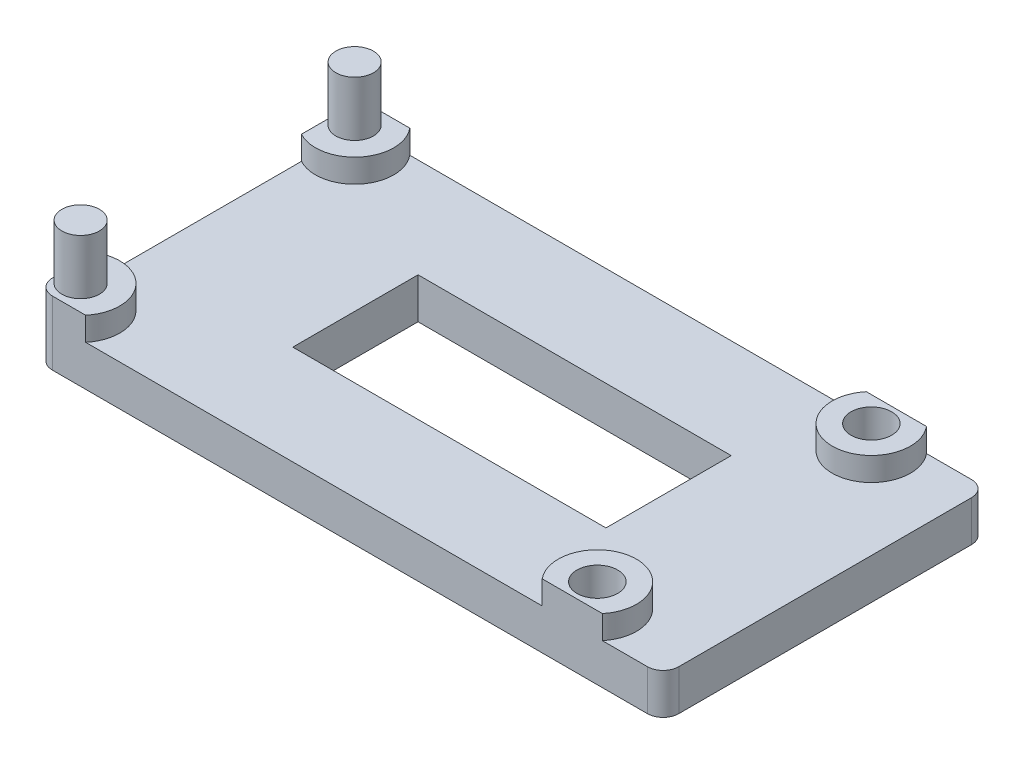
ISO-10303-21;
HEADER;
FILE_DESCRIPTION(('STEP AP214'),'2;1');
FILE_NAME('part.step','',(''),(''),'','','');
FILE_SCHEMA(('AUTOMOTIVE_DESIGN { 1 0 10303 214 1 1 1 1 }'));
ENDSEC;
DATA;
#1=APPLICATION_CONTEXT('core data for automotive mechanical design processes');
#2=APPLICATION_PROTOCOL_DEFINITION('international standard','automotive_design',2000,#1);
#3=PRODUCT_CONTEXT('',#1,'mechanical');
#4=PRODUCT('Part','Part','',(#3));
#5=PRODUCT_RELATED_PRODUCT_CATEGORY('part','',(#4));
#6=PRODUCT_DEFINITION_FORMATION('','',#4);
#7=PRODUCT_DEFINITION_CONTEXT('part definition',#1,'design');
#8=PRODUCT_DEFINITION('design','',#6,#7);
#9=PRODUCT_DEFINITION_SHAPE('','',#8);
#10=(LENGTH_UNIT() NAMED_UNIT(*) SI_UNIT(.MILLI.,.METRE.));
#11=(NAMED_UNIT(*) PLANE_ANGLE_UNIT() SI_UNIT($,.RADIAN.));
#12=(NAMED_UNIT(*) SI_UNIT($,.STERADIAN.) SOLID_ANGLE_UNIT());
#13=UNCERTAINTY_MEASURE_WITH_UNIT(LENGTH_MEASURE(1.E-05),#10,'distance_accuracy_value','');
#14=(GEOMETRIC_REPRESENTATION_CONTEXT(3) GLOBAL_UNCERTAINTY_ASSIGNED_CONTEXT((#13)) GLOBAL_UNIT_ASSIGNED_CONTEXT((#10,
#11,#12)) REPRESENTATION_CONTEXT('',''));
#15=CARTESIAN_POINT('',(0.,0.,0.));
#16=DIRECTION('',(0.,0.,1.));
#17=DIRECTION('',(1.,0.,0.));
#18=AXIS2_PLACEMENT_3D('',#15,#16,#17);
#19=CARTESIAN_POINT('',(20.,4.1,10.35));
#20=DIRECTION('',(-1.,0.,0.));
#21=DIRECTION('',(0.,0.,1.));
#22=AXIS2_PLACEMENT_3D('',#19,#20,#21);
#23=PLANE('',#22);
#24=DIRECTION('',(0.,0.,-1.));
#25=VECTOR('',#24,1.);
#26=CARTESIAN_POINT('',(20.,2.6,10.35));
#27=LINE('',#26,#25);
#28=CARTESIAN_POINT('',(20.,2.6,9.35));
#29=VERTEX_POINT('',#28);
#30=CARTESIAN_POINT('',(20.,2.6,-9.35));
#31=VERTEX_POINT('',#30);
#32=EDGE_CURVE('E238',#29,#31,#27,.T.);
#33=ORIENTED_EDGE('',*,*,#32,.F.);
#34=DIRECTION('',(0.,-1.,0.));
#35=VECTOR('',#34,1.);
#36=CARTESIAN_POINT('',(20.,4.1,9.35));
#37=LINE('',#36,#35);
#38=CARTESIAN_POINT('',(20.,0.,9.35));
#39=VERTEX_POINT('',#38);
#40=EDGE_CURVE('E334',#29,#39,#37,.T.);
#41=ORIENTED_EDGE('',*,*,#40,.T.);
#42=DIRECTION('',(0.,0.,-1.));
#43=VECTOR('',#42,1.);
#44=CARTESIAN_POINT('',(20.,0.,10.35));
#45=LINE('',#44,#43);
#46=CARTESIAN_POINT('',(20.,0.,-9.35));
#47=VERTEX_POINT('',#46);
#48=EDGE_CURVE('E287',#39,#47,#45,.T.);
#49=ORIENTED_EDGE('',*,*,#48,.T.);
#50=DIRECTION('',(0.,-1.,0.));
#51=VECTOR('',#50,1.);
#52=CARTESIAN_POINT('',(20.,4.1,-9.35));
#53=LINE('',#52,#51);
#54=EDGE_CURVE('E336',#47,#31,#53,.F.);
#55=ORIENTED_EDGE('',*,*,#54,.T.);
#56=EDGE_LOOP('',(#33,#41,#49,#55));
#57=FACE_BOUND('',#56,.T.);
#58=ADVANCED_FACE('F33',(#57),#23,.F.);
#59=CARTESIAN_POINT('',(-20.,4.1,-10.35));
#60=DIRECTION('',(0.,0.,1.));
#61=DIRECTION('',(1.,0.,0.));
#62=AXIS2_PLACEMENT_3D('',#59,#60,#61);
#63=PLANE('',#62);
#64=DIRECTION('',(-1.,0.,0.));
#65=VECTOR('',#64,1.);
#66=CARTESIAN_POINT('',(-20.,2.6,-10.35));
#67=LINE('',#66,#65);
#68=CARTESIAN_POINT('',(19.,2.6,-10.35));
#69=VERTEX_POINT('',#68);
#70=CARTESIAN_POINT('',(16.1209372712298,2.6,-10.35));
#71=VERTEX_POINT('',#70);
#72=EDGE_CURVE('E244',#69,#71,#67,.T.);
#73=ORIENTED_EDGE('',*,*,#72,.F.);
#74=DIRECTION('',(0.,-1.,0.));
#75=VECTOR('',#74,1.);
#76=CARTESIAN_POINT('',(19.,4.1,-10.35));
#77=LINE('',#76,#75);
#78=CARTESIAN_POINT('',(19.,0.,-10.35));
#79=VERTEX_POINT('',#78);
#80=EDGE_CURVE('E325',#69,#79,#77,.T.);
#81=ORIENTED_EDGE('',*,*,#80,.T.);
#82=DIRECTION('',(-1.,0.,0.));
#83=VECTOR('',#82,1.);
#84=CARTESIAN_POINT('',(-20.,0.,-10.35));
#85=LINE('',#84,#83);
#86=CARTESIAN_POINT('',(-19.,0.,-10.35));
#87=VERTEX_POINT('',#86);
#88=EDGE_CURVE('E305',#79,#87,#85,.T.);
#89=ORIENTED_EDGE('',*,*,#88,.T.);
#90=DIRECTION('',(0.,-1.,0.));
#91=VECTOR('',#90,1.);
#92=CARTESIAN_POINT('',(-19.,4.1,-10.35));
#93=LINE('',#92,#91);
#94=CARTESIAN_POINT('',(-19.,4.1,-10.35));
#95=VERTEX_POINT('',#94);
#96=EDGE_CURVE('E327',#87,#95,#93,.F.);
#97=ORIENTED_EDGE('',*,*,#96,.T.);
#98=DIRECTION('',(-1.,0.,0.));
#99=VECTOR('',#98,1.);
#100=CARTESIAN_POINT('',(-20.,4.1,-10.35));
#101=LINE('',#100,#99);
#102=CARTESIAN_POINT('',(-16.8790627287702,4.1,-10.35));
#103=VERTEX_POINT('',#102);
#104=EDGE_CURVE('E290',#103,#95,#101,.T.);
#105=ORIENTED_EDGE('',*,*,#104,.F.);
#106=DIRECTION('',(0.,1.,0.));
#107=VECTOR('',#106,1.);
#108=CARTESIAN_POINT('',(-16.8790627287702,2.6,-10.35));
#109=LINE('',#108,#107);
#110=CARTESIAN_POINT('',(-16.8790627287702,2.6,-10.35));
#111=VERTEX_POINT('',#110);
#112=EDGE_CURVE('E263',#111,#103,#109,.T.);
#113=ORIENTED_EDGE('',*,*,#112,.F.);
#114=CARTESIAN_POINT('',(12.2790627287701,2.6,-10.35));
#115=VERTEX_POINT('',#114);
#116=EDGE_CURVE('E246',#115,#111,#67,.T.);
#117=ORIENTED_EDGE('',*,*,#116,.F.);
#118=DIRECTION('',(0.,1.,0.));
#119=VECTOR('',#118,1.);
#120=CARTESIAN_POINT('',(12.2790627287701,2.6,-10.35));
#121=LINE('',#120,#119);
#122=CARTESIAN_POINT('',(12.2790627287701,4.1,-10.35));
#123=VERTEX_POINT('',#122);
#124=EDGE_CURVE('E249',#123,#115,#121,.F.);
#125=ORIENTED_EDGE('',*,*,#124,.F.);
#126=CARTESIAN_POINT('',(16.1209372712298,4.1,-10.35));
#127=VERTEX_POINT('',#126);
#128=EDGE_CURVE('E292',#127,#123,#101,.T.);
#129=ORIENTED_EDGE('',*,*,#128,.F.);
#130=DIRECTION('',(0.,1.,0.));
#131=VECTOR('',#130,1.);
#132=CARTESIAN_POINT('',(16.1209372712298,2.6,-10.35));
#133=LINE('',#132,#131);
#134=EDGE_CURVE('E251',#71,#127,#133,.T.);
#135=ORIENTED_EDGE('',*,*,#134,.F.);
#136=EDGE_LOOP('',(#73,#81,#89,#97,#105,#113,#117,#125,#129,#135));
#137=FACE_BOUND('',#136,.T.);
#138=ADVANCED_FACE('F369',(#137),#63,.F.);
#139=CARTESIAN_POINT('',(-20.,4.1,10.35));
#140=DIRECTION('',(1.,0.,0.));
#141=DIRECTION('',(0.,0.,-1.));
#142=AXIS2_PLACEMENT_3D('',#139,#140,#141);
#143=PLANE('',#142);
#144=DIRECTION('',(0.,1.,0.));
#145=VECTOR('',#144,1.);
#146=CARTESIAN_POINT('',(-20.,2.6,-6.55682878005387));
#147=LINE('',#146,#145);
#148=CARTESIAN_POINT('',(-20.,4.1,-6.55682878005387));
#149=VERTEX_POINT('',#148);
#150=CARTESIAN_POINT('',(-20.,2.6,-6.55682878005387));
#151=VERTEX_POINT('',#150);
#152=EDGE_CURVE('E261',#149,#151,#147,.F.);
#153=ORIENTED_EDGE('',*,*,#152,.F.);
#154=DIRECTION('',(0.,0.,1.));
#155=VECTOR('',#154,1.);
#156=CARTESIAN_POINT('',(-20.,4.1,10.35));
#157=LINE('',#156,#155);
#158=CARTESIAN_POINT('',(-20.,4.1,-8.75));
#159=VERTEX_POINT('',#158);
#160=EDGE_CURVE('E297',#159,#149,#157,.T.);
#161=ORIENTED_EDGE('',*,*,#160,.F.);
#162=CARTESIAN_POINT('',(-20.,4.1,-9.35));
#163=VERTEX_POINT('',#162);
#164=EDGE_CURVE('E294',#163,#159,#157,.T.);
#165=ORIENTED_EDGE('',*,*,#164,.F.);
#166=DIRECTION('',(0.,-1.,0.));
#167=VECTOR('',#166,1.);
#168=CARTESIAN_POINT('',(-20.,4.1,-9.35));
#169=LINE('',#168,#167);
#170=CARTESIAN_POINT('',(-20.,0.,-9.35));
#171=VERTEX_POINT('',#170);
#172=EDGE_CURVE('E314',#163,#171,#169,.T.);
#173=ORIENTED_EDGE('',*,*,#172,.T.);
#174=DIRECTION('',(0.,0.,1.));
#175=VECTOR('',#174,1.);
#176=CARTESIAN_POINT('',(-20.,0.,10.35));
#177=LINE('',#176,#175);
#178=CARTESIAN_POINT('',(-20.,0.,9.35));
#179=VERTEX_POINT('',#178);
#180=EDGE_CURVE('E308',#171,#179,#177,.T.);
#181=ORIENTED_EDGE('',*,*,#180,.T.);
#182=DIRECTION('',(0.,-1.,0.));
#183=VECTOR('',#182,1.);
#184=CARTESIAN_POINT('',(-20.,4.1,9.35));
#185=LINE('',#184,#183);
#186=CARTESIAN_POINT('',(-20.,4.1,9.35));
#187=VERTEX_POINT('',#186);
#188=EDGE_CURVE('E302',#179,#187,#185,.F.);
#189=ORIENTED_EDGE('',*,*,#188,.T.);
#190=CARTESIAN_POINT('',(-20.,4.1,8.75));
#191=VERTEX_POINT('',#190);
#192=EDGE_CURVE('E377',#191,#187,#157,.T.);
#193=ORIENTED_EDGE('',*,*,#192,.F.);
#194=CARTESIAN_POINT('',(-20.,4.1,6.55682878005387));
#195=VERTEX_POINT('',#194);
#196=EDGE_CURVE('E298',#195,#191,#157,.T.);
#197=ORIENTED_EDGE('',*,*,#196,.F.);
#198=DIRECTION('',(0.,1.,0.));
#199=VECTOR('',#198,1.);
#200=CARTESIAN_POINT('',(-20.,2.6,6.55682878005387));
#201=LINE('',#200,#199);
#202=CARTESIAN_POINT('',(-20.,2.6,6.55682878005387));
#203=VERTEX_POINT('',#202);
#204=EDGE_CURVE('E259',#203,#195,#201,.T.);
#205=ORIENTED_EDGE('',*,*,#204,.F.);
#206=DIRECTION('',(0.,0.,1.));
#207=VECTOR('',#206,1.);
#208=CARTESIAN_POINT('',(-20.,2.6,10.35));
#209=LINE('',#208,#207);
#210=EDGE_CURVE('E247',#151,#203,#209,.T.);
#211=ORIENTED_EDGE('',*,*,#210,.F.);
#212=EDGE_LOOP('',(#153,#161,#165,#173,#181,#189,#193,#197,#205,#211));
#213=FACE_BOUND('',#212,.T.);
#214=ADVANCED_FACE('F392',(#213),#143,.F.);
#215=CARTESIAN_POINT('',(-20.,4.1,10.35));
#216=DIRECTION('',(0.,0.,-1.));
#217=DIRECTION('',(-1.,0.,0.));
#218=AXIS2_PLACEMENT_3D('',#215,#216,#217);
#219=PLANE('',#218);
#220=DIRECTION('',(0.,1.,0.));
#221=VECTOR('',#220,1.);
#222=CARTESIAN_POINT('',(-16.8790627287701,2.6,10.35));
#223=LINE('',#222,#221);
#224=CARTESIAN_POINT('',(-16.8790627287701,4.1,10.35));
#225=VERTEX_POINT('',#224);
#226=CARTESIAN_POINT('',(-16.8790627287701,2.6,10.35));
#227=VERTEX_POINT('',#226);
#228=EDGE_CURVE('E257',#225,#227,#223,.F.);
#229=ORIENTED_EDGE('',*,*,#228,.F.);
#230=DIRECTION('',(1.,0.,0.));
#231=VECTOR('',#230,1.);
#232=CARTESIAN_POINT('',(-20.,4.1,10.35));
#233=LINE('',#232,#231);
#234=CARTESIAN_POINT('',(-19.,4.1,10.35));
#235=VERTEX_POINT('',#234);
#236=EDGE_CURVE('E299',#235,#225,#233,.T.);
#237=ORIENTED_EDGE('',*,*,#236,.F.);
#238=DIRECTION('',(0.,-1.,0.));
#239=VECTOR('',#238,1.);
#240=CARTESIAN_POINT('',(-19.,4.1,10.35));
#241=LINE('',#240,#239);
#242=CARTESIAN_POINT('',(-19.,0.,10.35));
#243=VERTEX_POINT('',#242);
#244=EDGE_CURVE('E339',#235,#243,#241,.T.);
#245=ORIENTED_EDGE('',*,*,#244,.T.);
#246=DIRECTION('',(1.,0.,0.));
#247=VECTOR('',#246,1.);
#248=CARTESIAN_POINT('',(-20.,0.,10.35));
#249=LINE('',#248,#247);
#250=CARTESIAN_POINT('',(19.,0.,10.35));
#251=VERTEX_POINT('',#250);
#252=EDGE_CURVE('E293',#243,#251,#249,.T.);
#253=ORIENTED_EDGE('',*,*,#252,.T.);
#254=DIRECTION('',(0.,-1.,0.));
#255=VECTOR('',#254,1.);
#256=CARTESIAN_POINT('',(19.,4.1,10.35));
#257=LINE('',#256,#255);
#258=CARTESIAN_POINT('',(19.,2.6,10.35));
#259=VERTEX_POINT('',#258);
#260=EDGE_CURVE('E41',#251,#259,#257,.F.);
#261=ORIENTED_EDGE('',*,*,#260,.T.);
#262=DIRECTION('',(1.,0.,0.));
#263=VECTOR('',#262,1.);
#264=CARTESIAN_POINT('',(-20.,2.6,10.35));
#265=LINE('',#264,#263);
#266=CARTESIAN_POINT('',(16.1209372712299,2.6,10.35));
#267=VERTEX_POINT('',#266);
#268=EDGE_CURVE('E234',#267,#259,#265,.T.);
#269=ORIENTED_EDGE('',*,*,#268,.F.);
#270=DIRECTION('',(0.,1.,0.));
#271=VECTOR('',#270,1.);
#272=CARTESIAN_POINT('',(16.1209372712299,2.6,10.35));
#273=LINE('',#272,#271);
#274=CARTESIAN_POINT('',(16.1209372712299,4.1,10.35));
#275=VERTEX_POINT('',#274);
#276=EDGE_CURVE('E253',#275,#267,#273,.F.);
#277=ORIENTED_EDGE('',*,*,#276,.F.);
#278=CARTESIAN_POINT('',(12.2790627287701,4.1,10.35));
#279=VERTEX_POINT('',#278);
#280=EDGE_CURVE('E296',#279,#275,#233,.T.);
#281=ORIENTED_EDGE('',*,*,#280,.F.);
#282=DIRECTION('',(0.,1.,0.));
#283=VECTOR('',#282,1.);
#284=CARTESIAN_POINT('',(12.2790627287701,2.6,10.35));
#285=LINE('',#284,#283);
#286=CARTESIAN_POINT('',(12.2790627287701,2.6,10.35));
#287=VERTEX_POINT('',#286);
#288=EDGE_CURVE('E255',#287,#279,#285,.T.);
#289=ORIENTED_EDGE('',*,*,#288,.F.);
#290=EDGE_CURVE('E239',#227,#287,#265,.T.);
#291=ORIENTED_EDGE('',*,*,#290,.F.);
#292=EDGE_LOOP('',(#229,#237,#245,#253,#261,#269,#277,#281,#289,#291));
#293=FACE_BOUND('',#292,.T.);
#294=ADVANCED_FACE('F346',(#293),#219,.F.);
#295=CARTESIAN_POINT('',(0.,4.1,0.));
#296=DIRECTION('',(0.,-1.,0.));
#297=DIRECTION('',(0.,0.,-1.));
#298=AXIS2_PLACEMENT_3D('',#295,#296,#297);
#299=PLANE('',#298);
#300=CARTESIAN_POINT('',(-18.8,4.1,-8.75));
#301=DIRECTION('',(0.,1.,0.));
#302=DIRECTION('',(0.,0.,1.));
#303=AXIS2_PLACEMENT_3D('',#300,#301,#302);
#304=CIRCLE('',#303,2.5);
#305=EDGE_CURVE('E228',#149,#103,#304,.T.);
#306=ORIENTED_EDGE('',*,*,#305,.T.);
#307=ORIENTED_EDGE('',*,*,#104,.T.);
#308=CARTESIAN_POINT('',(-19.,4.1,-9.35));
#309=DIRECTION('',(0.,-1.,0.));
#310=DIRECTION('',(0.,0.,-1.));
#311=AXIS2_PLACEMENT_3D('',#308,#309,#310);
#312=CIRCLE('',#311,1.);
#313=EDGE_CURVE('E332',#95,#163,#312,.F.);
#314=ORIENTED_EDGE('',*,*,#313,.T.);
#315=ORIENTED_EDGE('',*,*,#164,.T.);
#316=CARTESIAN_POINT('',(-18.8,4.1,-8.75));
#317=DIRECTION('',(0.,1.,0.));
#318=DIRECTION('',(0.,0.,1.));
#319=AXIS2_PLACEMENT_3D('',#316,#317,#318);
#320=CIRCLE('',#319,1.2);
#321=EDGE_CURVE('E281',#159,#159,#320,.T.);
#322=ORIENTED_EDGE('',*,*,#321,.F.);
#323=ORIENTED_EDGE('',*,*,#160,.T.);
#324=EDGE_LOOP('',(#306,#307,#314,#315,#322,#323));
#325=FACE_BOUND('',#324,.T.);
#326=ADVANCED_FACE('F387',(#325),#299,.F.);
#327=CARTESIAN_POINT('',(-18.8,4.1,8.75));
#328=DIRECTION('',(0.,1.,0.));
#329=DIRECTION('',(0.,0.,1.));
#330=AXIS2_PLACEMENT_3D('',#327,#328,#329);
#331=CIRCLE('',#330,2.5);
#332=EDGE_CURVE('E222',#225,#195,#331,.T.);
#333=ORIENTED_EDGE('',*,*,#332,.T.);
#334=ORIENTED_EDGE('',*,*,#196,.T.);
#335=CARTESIAN_POINT('',(-18.8,4.1,8.75));
#336=DIRECTION('',(0.,1.,0.));
#337=DIRECTION('',(0.,0.,1.));
#338=AXIS2_PLACEMENT_3D('',#335,#336,#337);
#339=CIRCLE('',#338,1.2);
#340=EDGE_CURVE('E269',#191,#191,#339,.T.);
#341=ORIENTED_EDGE('',*,*,#340,.F.);
#342=ORIENTED_EDGE('',*,*,#192,.T.);
#343=CARTESIAN_POINT('',(-19.,4.1,9.35));
#344=DIRECTION('',(0.,-1.,0.));
#345=DIRECTION('',(0.,0.,-1.));
#346=AXIS2_PLACEMENT_3D('',#343,#344,#345);
#347=CIRCLE('',#346,1.);
#348=EDGE_CURVE('E330',#187,#235,#347,.F.);
#349=ORIENTED_EDGE('',*,*,#348,.T.);
#350=ORIENTED_EDGE('',*,*,#236,.T.);
#351=EDGE_LOOP('',(#333,#334,#341,#342,#349,#350));
#352=FACE_BOUND('',#351,.T.);
#353=ADVANCED_FACE('F413',(#352),#299,.F.);
#354=CARTESIAN_POINT('',(14.2,4.1,8.75));
#355=DIRECTION('',(0.,1.,0.));
#356=DIRECTION('',(0.,0.,1.));
#357=AXIS2_PLACEMENT_3D('',#354,#355,#356);
#358=CIRCLE('',#357,1.3);
#359=CARTESIAN_POINT('',(14.2,4.1,10.05));
#360=VERTEX_POINT('',#359);
#361=EDGE_CURVE('E265',#360,#360,#358,.T.);
#362=ORIENTED_EDGE('',*,*,#361,.F.);
#363=EDGE_LOOP('',(#362));
#364=FACE_BOUND('',#363,.T.);
#365=CARTESIAN_POINT('',(14.2,4.1,8.75));
#366=DIRECTION('',(0.,1.,0.));
#367=DIRECTION('',(0.,0.,1.));
#368=AXIS2_PLACEMENT_3D('',#365,#366,#367);
#369=CIRCLE('',#368,2.5);
#370=EDGE_CURVE('E216',#275,#279,#369,.T.);
#371=ORIENTED_EDGE('',*,*,#370,.T.);
#372=ORIENTED_EDGE('',*,*,#280,.T.);
#373=EDGE_LOOP('',(#371,#372));
#374=FACE_BOUND('',#373,.T.);
#375=ADVANCED_FACE('F479',(#364,#374),#299,.F.);
#376=CARTESIAN_POINT('',(14.2,4.1,-8.75));
#377=DIRECTION('',(0.,1.,0.));
#378=DIRECTION('',(0.,0.,1.));
#379=AXIS2_PLACEMENT_3D('',#376,#377,#378);
#380=CIRCLE('',#379,1.3);
#381=CARTESIAN_POINT('',(14.2,4.1,-7.45));
#382=VERTEX_POINT('',#381);
#383=EDGE_CURVE('E270',#382,#382,#380,.T.);
#384=ORIENTED_EDGE('',*,*,#383,.F.);
#385=EDGE_LOOP('',(#384));
#386=FACE_BOUND('',#385,.T.);
#387=CARTESIAN_POINT('',(14.2,4.1,-8.75));
#388=DIRECTION('',(0.,1.,0.));
#389=DIRECTION('',(0.,0.,1.));
#390=AXIS2_PLACEMENT_3D('',#387,#388,#389);
#391=CIRCLE('',#390,2.5);
#392=EDGE_CURVE('E209',#123,#127,#391,.T.);
#393=ORIENTED_EDGE('',*,*,#392,.T.);
#394=ORIENTED_EDGE('',*,*,#128,.T.);
#395=EDGE_LOOP('',(#393,#394));
#396=FACE_BOUND('',#395,.T.);
#397=ADVANCED_FACE('F376',(#386,#396),#299,.F.);
#398=CARTESIAN_POINT('',(19.,4.1,-9.35));
#399=DIRECTION('',(0.,-1.,0.));
#400=DIRECTION('',(0.,0.,-1.));
#401=AXIS2_PLACEMENT_3D('',#398,#399,#400);
#402=CYLINDRICAL_SURFACE('',#401,1.);
#403=ORIENTED_EDGE('',*,*,#80,.F.);
#404=CARTESIAN_POINT('',(19.,2.6,-9.35));
#405=DIRECTION('',(0.,1.,0.));
#406=DIRECTION('',(0.,0.,1.));
#407=AXIS2_PLACEMENT_3D('',#404,#405,#406);
#408=CIRCLE('',#407,1.);
#409=EDGE_CURVE('E241',#69,#31,#408,.F.);
#410=ORIENTED_EDGE('',*,*,#409,.T.);
#411=ORIENTED_EDGE('',*,*,#54,.F.);
#412=CARTESIAN_POINT('',(19.,0.,-9.35));
#413=DIRECTION('',(0.,-1.,0.));
#414=DIRECTION('',(0.,0.,-1.));
#415=AXIS2_PLACEMENT_3D('',#412,#413,#414);
#416=CIRCLE('',#415,1.);
#417=EDGE_CURVE('E321',#79,#47,#416,.T.);
#418=ORIENTED_EDGE('',*,*,#417,.F.);
#419=EDGE_LOOP('',(#403,#410,#411,#418));
#420=FACE_BOUND('',#419,.T.);
#421=ADVANCED_FACE('F363',(#420),#402,.T.);
#422=CARTESIAN_POINT('',(19.,4.1,9.35));
#423=DIRECTION('',(0.,-1.,0.));
#424=DIRECTION('',(0.,0.,-1.));
#425=AXIS2_PLACEMENT_3D('',#422,#423,#424);
#426=CYLINDRICAL_SURFACE('',#425,1.);
#427=ORIENTED_EDGE('',*,*,#40,.F.);
#428=CARTESIAN_POINT('',(19.,2.6,9.35));
#429=DIRECTION('',(0.,1.,0.));
#430=DIRECTION('',(0.,0.,1.));
#431=AXIS2_PLACEMENT_3D('',#428,#429,#430);
#432=CIRCLE('',#431,1.);
#433=EDGE_CURVE('E11',#29,#259,#432,.F.);
#434=ORIENTED_EDGE('',*,*,#433,.T.);
#435=ORIENTED_EDGE('',*,*,#260,.F.);
#436=CARTESIAN_POINT('',(19.,0.,9.35));
#437=DIRECTION('',(0.,-1.,0.));
#438=DIRECTION('',(0.,0.,-1.));
#439=AXIS2_PLACEMENT_3D('',#436,#437,#438);
#440=CIRCLE('',#439,1.);
#441=EDGE_CURVE('E319',#39,#251,#440,.T.);
#442=ORIENTED_EDGE('',*,*,#441,.F.);
#443=EDGE_LOOP('',(#427,#434,#435,#442));
#444=FACE_BOUND('',#443,.T.);
#445=ADVANCED_FACE('F352',(#444),#426,.T.);
#446=CARTESIAN_POINT('',(0.,0.,0.));
#447=DIRECTION('',(0.,-1.,0.));
#448=DIRECTION('',(0.,0.,-1.));
#449=AXIS2_PLACEMENT_3D('',#446,#447,#448);
#450=PLANE('',#449);
#451=DIRECTION('',(0.,0.,-1.));
#452=VECTOR('',#451,1.);
#453=CARTESIAN_POINT('',(10.,0.,4.));
#454=LINE('',#453,#452);
#455=CARTESIAN_POINT('',(10.,0.,4.));
#456=VERTEX_POINT('',#455);
#457=CARTESIAN_POINT('',(10.,0.,-4.));
#458=VERTEX_POINT('',#457);
#459=EDGE_CURVE('E178',#456,#458,#454,.T.);
#460=ORIENTED_EDGE('',*,*,#459,.T.);
#461=DIRECTION('',(-1.,0.,0.));
#462=VECTOR('',#461,1.);
#463=CARTESIAN_POINT('',(-10.,0.,-4.));
#464=LINE('',#463,#462);
#465=CARTESIAN_POINT('',(-10.,0.,-4.));
#466=VERTEX_POINT('',#465);
#467=EDGE_CURVE('E187',#458,#466,#464,.T.);
#468=ORIENTED_EDGE('',*,*,#467,.T.);
#469=DIRECTION('',(0.,0.,1.));
#470=VECTOR('',#469,1.);
#471=CARTESIAN_POINT('',(-10.,0.,4.));
#472=LINE('',#471,#470);
#473=CARTESIAN_POINT('',(-10.,0.,4.));
#474=VERTEX_POINT('',#473);
#475=EDGE_CURVE('E48',#466,#474,#472,.T.);
#476=ORIENTED_EDGE('',*,*,#475,.T.);
#477=DIRECTION('',(1.,0.,0.));
#478=VECTOR('',#477,1.);
#479=CARTESIAN_POINT('',(-10.,0.,4.));
#480=LINE('',#479,#478);
#481=EDGE_CURVE('E184',#474,#456,#480,.T.);
#482=ORIENTED_EDGE('',*,*,#481,.T.);
#483=EDGE_LOOP('',(#460,#468,#476,#482));
#484=FACE_BOUND('',#483,.T.);
#485=CARTESIAN_POINT('',(14.2,0.,-8.75));
#486=DIRECTION('',(0.,1.,0.));
#487=DIRECTION('',(0.,0.,1.));
#488=AXIS2_PLACEMENT_3D('',#485,#486,#487);
#489=CIRCLE('',#488,1.3);
#490=CARTESIAN_POINT('',(14.2,0.,-7.45));
#491=VERTEX_POINT('',#490);
#492=EDGE_CURVE('E266',#491,#491,#489,.T.);
#493=ORIENTED_EDGE('',*,*,#492,.T.);
#494=EDGE_LOOP('',(#493));
#495=FACE_BOUND('',#494,.T.);
#496=CARTESIAN_POINT('',(14.2,0.,8.75));
#497=DIRECTION('',(0.,1.,0.));
#498=DIRECTION('',(0.,0.,1.));
#499=AXIS2_PLACEMENT_3D('',#496,#497,#498);
#500=CIRCLE('',#499,1.3);
#501=CARTESIAN_POINT('',(14.2,0.,10.05));
#502=VERTEX_POINT('',#501);
#503=EDGE_CURVE('E273',#502,#502,#500,.T.);
#504=ORIENTED_EDGE('',*,*,#503,.T.);
#505=EDGE_LOOP('',(#504));
#506=FACE_BOUND('',#505,.T.);
#507=ORIENTED_EDGE('',*,*,#180,.F.);
#508=CARTESIAN_POINT('',(-19.,0.,-9.35));
#509=DIRECTION('',(0.,-1.,0.));
#510=DIRECTION('',(0.,0.,-1.));
#511=AXIS2_PLACEMENT_3D('',#508,#509,#510);
#512=CIRCLE('',#511,1.);
#513=EDGE_CURVE('E323',#171,#87,#512,.T.);
#514=ORIENTED_EDGE('',*,*,#513,.T.);
#515=ORIENTED_EDGE('',*,*,#88,.F.);
#516=ORIENTED_EDGE('',*,*,#417,.T.);
#517=ORIENTED_EDGE('',*,*,#48,.F.);
#518=ORIENTED_EDGE('',*,*,#441,.T.);
#519=ORIENTED_EDGE('',*,*,#252,.F.);
#520=CARTESIAN_POINT('',(-19.,0.,9.35));
#521=DIRECTION('',(0.,-1.,0.));
#522=DIRECTION('',(0.,0.,-1.));
#523=AXIS2_PLACEMENT_3D('',#520,#521,#522);
#524=CIRCLE('',#523,1.);
#525=EDGE_CURVE('E317',#243,#179,#524,.T.);
#526=ORIENTED_EDGE('',*,*,#525,.T.);
#527=EDGE_LOOP('',(#507,#514,#515,#516,#517,#518,#519,#526));
#528=FACE_BOUND('',#527,.T.);
#529=ADVANCED_FACE('F191',(#484,#495,#506,#528),#450,.T.);
#530=CARTESIAN_POINT('',(-18.8,7.6,-8.75));
#531=DIRECTION('',(0.,-1.,0.));
#532=DIRECTION('',(0.,0.,-1.));
#533=AXIS2_PLACEMENT_3D('',#530,#531,#532);
#534=CYLINDRICAL_SURFACE('',#533,1.2);
#535=CARTESIAN_POINT('',(-18.8,7.6,-8.75));
#536=DIRECTION('',(0.,1.,0.));
#537=DIRECTION('',(0.,0.,1.));
#538=AXIS2_PLACEMENT_3D('',#535,#536,#537);
#539=CIRCLE('',#538,1.2);
#540=CARTESIAN_POINT('',(-18.8,7.6,-7.55));
#541=VERTEX_POINT('',#540);
#542=EDGE_CURVE('E284',#541,#541,#539,.T.);
#543=ORIENTED_EDGE('',*,*,#542,.F.);
#544=EDGE_LOOP('',(#543));
#545=FACE_BOUND('',#544,.T.);
#546=ORIENTED_EDGE('',*,*,#321,.T.);
#547=EDGE_LOOP('',(#546));
#548=FACE_BOUND('',#547,.T.);
#549=ADVANCED_FACE('F430',(#545,#548),#534,.T.);
#550=CARTESIAN_POINT('',(-18.8,7.6,-8.75));
#551=DIRECTION('',(0.,1.,0.));
#552=DIRECTION('',(0.,0.,1.));
#553=AXIS2_PLACEMENT_3D('',#550,#551,#552);
#554=PLANE('',#553);
#555=ORIENTED_EDGE('',*,*,#542,.T.);
#556=EDGE_LOOP('',(#555));
#557=FACE_BOUND('',#556,.T.);
#558=ADVANCED_FACE('F420',(#557),#554,.T.);
#559=CARTESIAN_POINT('',(-18.8,7.6,8.75));
#560=DIRECTION('',(0.,-1.,0.));
#561=DIRECTION('',(0.,0.,-1.));
#562=AXIS2_PLACEMENT_3D('',#559,#560,#561);
#563=CYLINDRICAL_SURFACE('',#562,1.2);
#564=CARTESIAN_POINT('',(-18.8,7.6,8.75));
#565=DIRECTION('',(0.,1.,0.));
#566=DIRECTION('',(0.,0.,1.));
#567=AXIS2_PLACEMENT_3D('',#564,#565,#566);
#568=CIRCLE('',#567,1.2);
#569=CARTESIAN_POINT('',(-18.8,7.6,9.95));
#570=VERTEX_POINT('',#569);
#571=EDGE_CURVE('E278',#570,#570,#568,.T.);
#572=ORIENTED_EDGE('',*,*,#571,.F.);
#573=EDGE_LOOP('',(#572));
#574=FACE_BOUND('',#573,.T.);
#575=ORIENTED_EDGE('',*,*,#340,.T.);
#576=EDGE_LOOP('',(#575));
#577=FACE_BOUND('',#576,.T.);
#578=ADVANCED_FACE('F417',(#574,#577),#563,.T.);
#579=CARTESIAN_POINT('',(-18.8,7.6,8.75));
#580=DIRECTION('',(0.,1.,0.));
#581=DIRECTION('',(0.,0.,1.));
#582=AXIS2_PLACEMENT_3D('',#579,#580,#581);
#583=PLANE('',#582);
#584=ORIENTED_EDGE('',*,*,#571,.T.);
#585=EDGE_LOOP('',(#584));
#586=FACE_BOUND('',#585,.T.);
#587=ADVANCED_FACE('F419',(#586),#583,.T.);
#588=CARTESIAN_POINT('',(14.2,0.,8.75));
#589=DIRECTION('',(0.,1.,0.));
#590=DIRECTION('',(0.,0.,1.));
#591=AXIS2_PLACEMENT_3D('',#588,#589,#590);
#592=CYLINDRICAL_SURFACE('',#591,1.3);
#593=ORIENTED_EDGE('',*,*,#503,.F.);
#594=EDGE_LOOP('',(#593));
#595=FACE_BOUND('',#594,.T.);
#596=ORIENTED_EDGE('',*,*,#361,.T.);
#597=EDGE_LOOP('',(#596));
#598=FACE_BOUND('',#597,.T.);
#599=ADVANCED_FACE('F427',(#595,#598),#592,.F.);
#600=CARTESIAN_POINT('',(14.2,0.,-8.75));
#601=DIRECTION('',(0.,1.,0.));
#602=DIRECTION('',(0.,0.,1.));
#603=AXIS2_PLACEMENT_3D('',#600,#601,#602);
#604=CYLINDRICAL_SURFACE('',#603,1.3);
#605=ORIENTED_EDGE('',*,*,#492,.F.);
#606=EDGE_LOOP('',(#605));
#607=FACE_BOUND('',#606,.T.);
#608=ORIENTED_EDGE('',*,*,#383,.T.);
#609=EDGE_LOOP('',(#608));
#610=FACE_BOUND('',#609,.T.);
#611=ADVANCED_FACE('F444',(#607,#610),#604,.F.);
#612=CARTESIAN_POINT('',(-19.,4.1,-9.35));
#613=DIRECTION('',(0.,-1.,0.));
#614=DIRECTION('',(0.,0.,-1.));
#615=AXIS2_PLACEMENT_3D('',#612,#613,#614);
#616=CYLINDRICAL_SURFACE('',#615,1.);
#617=ORIENTED_EDGE('',*,*,#313,.F.);
#618=ORIENTED_EDGE('',*,*,#96,.F.);
#619=ORIENTED_EDGE('',*,*,#513,.F.);
#620=ORIENTED_EDGE('',*,*,#172,.F.);
#621=EDGE_LOOP('',(#617,#618,#619,#620));
#622=FACE_BOUND('',#621,.T.);
#623=ADVANCED_FACE('F405',(#622),#616,.T.);
#624=CARTESIAN_POINT('',(-19.,4.1,9.35));
#625=DIRECTION('',(0.,-1.,0.));
#626=DIRECTION('',(0.,0.,-1.));
#627=AXIS2_PLACEMENT_3D('',#624,#625,#626);
#628=CYLINDRICAL_SURFACE('',#627,1.);
#629=ORIENTED_EDGE('',*,*,#348,.F.);
#630=ORIENTED_EDGE('',*,*,#188,.F.);
#631=ORIENTED_EDGE('',*,*,#525,.F.);
#632=ORIENTED_EDGE('',*,*,#244,.F.);
#633=EDGE_LOOP('',(#629,#630,#631,#632));
#634=FACE_BOUND('',#633,.T.);
#635=ADVANCED_FACE('F35',(#634),#628,.T.);
#636=CARTESIAN_POINT('',(-18.8,2.6,-8.75));
#637=DIRECTION('',(0.,1.,0.));
#638=DIRECTION('',(0.,0.,1.));
#639=AXIS2_PLACEMENT_3D('',#636,#637,#638);
#640=CYLINDRICAL_SURFACE('',#639,2.5);
#641=ORIENTED_EDGE('',*,*,#112,.T.);
#642=ORIENTED_EDGE('',*,*,#305,.F.);
#643=ORIENTED_EDGE('',*,*,#152,.T.);
#644=CARTESIAN_POINT('',(-18.8,2.6,-8.75));
#645=DIRECTION('',(0.,1.,0.));
#646=DIRECTION('',(0.,0.,1.));
#647=AXIS2_PLACEMENT_3D('',#644,#645,#646);
#648=CIRCLE('',#647,2.5);
#649=EDGE_CURVE('E231',#151,#111,#648,.T.);
#650=ORIENTED_EDGE('',*,*,#649,.T.);
#651=EDGE_LOOP('',(#641,#642,#643,#650));
#652=FACE_BOUND('',#651,.T.);
#653=ADVANCED_FACE('F398',(#652),#640,.T.);
#654=CARTESIAN_POINT('',(-18.8,2.6,8.75));
#655=DIRECTION('',(0.,1.,0.));
#656=DIRECTION('',(0.,0.,1.));
#657=AXIS2_PLACEMENT_3D('',#654,#655,#656);
#658=CYLINDRICAL_SURFACE('',#657,2.5);
#659=ORIENTED_EDGE('',*,*,#204,.T.);
#660=ORIENTED_EDGE('',*,*,#332,.F.);
#661=ORIENTED_EDGE('',*,*,#228,.T.);
#662=CARTESIAN_POINT('',(-18.8,2.6,8.75));
#663=DIRECTION('',(0.,1.,0.));
#664=DIRECTION('',(0.,0.,1.));
#665=AXIS2_PLACEMENT_3D('',#662,#663,#664);
#666=CIRCLE('',#665,2.5);
#667=EDGE_CURVE('E225',#227,#203,#666,.T.);
#668=ORIENTED_EDGE('',*,*,#667,.T.);
#669=EDGE_LOOP('',(#659,#660,#661,#668));
#670=FACE_BOUND('',#669,.T.);
#671=ADVANCED_FACE('F509',(#670),#658,.T.);
#672=CARTESIAN_POINT('',(14.2,2.6,8.75));
#673=DIRECTION('',(0.,1.,0.));
#674=DIRECTION('',(0.,0.,1.));
#675=AXIS2_PLACEMENT_3D('',#672,#673,#674);
#676=CYLINDRICAL_SURFACE('',#675,2.5);
#677=ORIENTED_EDGE('',*,*,#288,.T.);
#678=ORIENTED_EDGE('',*,*,#370,.F.);
#679=ORIENTED_EDGE('',*,*,#276,.T.);
#680=CARTESIAN_POINT('',(14.2,2.6,8.75));
#681=DIRECTION('',(0.,1.,0.));
#682=DIRECTION('',(0.,0.,1.));
#683=AXIS2_PLACEMENT_3D('',#680,#681,#682);
#684=CIRCLE('',#683,2.5);
#685=EDGE_CURVE('E219',#267,#287,#684,.T.);
#686=ORIENTED_EDGE('',*,*,#685,.T.);
#687=EDGE_LOOP('',(#677,#678,#679,#686));
#688=FACE_BOUND('',#687,.T.);
#689=ADVANCED_FACE('F520',(#688),#676,.T.);
#690=CARTESIAN_POINT('',(14.2,2.6,-8.75));
#691=DIRECTION('',(0.,1.,0.));
#692=DIRECTION('',(0.,0.,1.));
#693=AXIS2_PLACEMENT_3D('',#690,#691,#692);
#694=CYLINDRICAL_SURFACE('',#693,2.5);
#695=ORIENTED_EDGE('',*,*,#134,.T.);
#696=ORIENTED_EDGE('',*,*,#392,.F.);
#697=ORIENTED_EDGE('',*,*,#124,.T.);
#698=CARTESIAN_POINT('',(14.2,2.6,-8.75));
#699=DIRECTION('',(0.,1.,0.));
#700=DIRECTION('',(0.,0.,1.));
#701=AXIS2_PLACEMENT_3D('',#698,#699,#700);
#702=CIRCLE('',#701,2.5);
#703=EDGE_CURVE('E213',#115,#71,#702,.T.);
#704=ORIENTED_EDGE('',*,*,#703,.T.);
#705=EDGE_LOOP('',(#695,#696,#697,#704));
#706=FACE_BOUND('',#705,.T.);
#707=ADVANCED_FACE('F374',(#706),#694,.T.);
#708=CARTESIAN_POINT('',(0.,2.6,0.));
#709=DIRECTION('',(0.,1.,0.));
#710=DIRECTION('',(0.,0.,1.));
#711=AXIS2_PLACEMENT_3D('',#708,#709,#710);
#712=PLANE('',#711);
#713=DIRECTION('',(0.,0.,-1.));
#714=VECTOR('',#713,1.);
#715=CARTESIAN_POINT('',(10.,2.6,4.));
#716=LINE('',#715,#714);
#717=CARTESIAN_POINT('',(10.,2.6,4.));
#718=VERTEX_POINT('',#717);
#719=CARTESIAN_POINT('',(10.,2.6,-4.));
#720=VERTEX_POINT('',#719);
#721=EDGE_CURVE('E56',#718,#720,#716,.T.);
#722=ORIENTED_EDGE('',*,*,#721,.F.);
#723=DIRECTION('',(1.,0.,0.));
#724=VECTOR('',#723,1.);
#725=CARTESIAN_POINT('',(-10.,2.6,4.));
#726=LINE('',#725,#724);
#727=CARTESIAN_POINT('',(-10.,2.6,4.));
#728=VERTEX_POINT('',#727);
#729=EDGE_CURVE('E194',#728,#718,#726,.T.);
#730=ORIENTED_EDGE('',*,*,#729,.F.);
#731=DIRECTION('',(0.,0.,1.));
#732=VECTOR('',#731,1.);
#733=CARTESIAN_POINT('',(-10.,2.6,4.));
#734=LINE('',#733,#732);
#735=CARTESIAN_POINT('',(-10.,2.6,-4.));
#736=VERTEX_POINT('',#735);
#737=EDGE_CURVE('E197',#736,#728,#734,.T.);
#738=ORIENTED_EDGE('',*,*,#737,.F.);
#739=DIRECTION('',(-1.,0.,0.));
#740=VECTOR('',#739,1.);
#741=CARTESIAN_POINT('',(-10.,2.6,-4.));
#742=LINE('',#741,#740);
#743=EDGE_CURVE('E203',#720,#736,#742,.T.);
#744=ORIENTED_EDGE('',*,*,#743,.F.);
#745=EDGE_LOOP('',(#722,#730,#738,#744));
#746=FACE_BOUND('',#745,.T.);
#747=ORIENTED_EDGE('',*,*,#116,.T.);
#748=ORIENTED_EDGE('',*,*,#649,.F.);
#749=ORIENTED_EDGE('',*,*,#210,.T.);
#750=ORIENTED_EDGE('',*,*,#667,.F.);
#751=ORIENTED_EDGE('',*,*,#290,.T.);
#752=ORIENTED_EDGE('',*,*,#685,.F.);
#753=ORIENTED_EDGE('',*,*,#268,.T.);
#754=ORIENTED_EDGE('',*,*,#433,.F.);
#755=ORIENTED_EDGE('',*,*,#32,.T.);
#756=ORIENTED_EDGE('',*,*,#409,.F.);
#757=ORIENTED_EDGE('',*,*,#72,.T.);
#758=ORIENTED_EDGE('',*,*,#703,.F.);
#759=EDGE_LOOP('',(#747,#748,#749,#750,#751,#752,#753,#754,#755,#756,#757,#758));
#760=FACE_BOUND('',#759,.T.);
#761=ADVANCED_FACE('F356',(#746,#760),#712,.T.);
#762=CARTESIAN_POINT('',(10.,0.,4.));
#763=DIRECTION('',(1.,0.,0.));
#764=DIRECTION('',(0.,0.,-1.));
#765=AXIS2_PLACEMENT_3D('',#762,#763,#764);
#766=PLANE('',#765);
#767=ORIENTED_EDGE('',*,*,#721,.T.);
#768=DIRECTION('',(0.,1.,0.));
#769=VECTOR('',#768,1.);
#770=CARTESIAN_POINT('',(10.,0.,-4.));
#771=LINE('',#770,#769);
#772=EDGE_CURVE('E174',#458,#720,#771,.T.);
#773=ORIENTED_EDGE('',*,*,#772,.F.);
#774=ORIENTED_EDGE('',*,*,#459,.F.);
#775=DIRECTION('',(0.,1.,0.));
#776=VECTOR('',#775,1.);
#777=CARTESIAN_POINT('',(10.,0.,4.));
#778=LINE('',#777,#776);
#779=EDGE_CURVE('E207',#456,#718,#778,.T.);
#780=ORIENTED_EDGE('',*,*,#779,.T.);
#781=EDGE_LOOP('',(#767,#773,#774,#780));
#782=FACE_BOUND('',#781,.T.);
#783=ADVANCED_FACE('F176',(#782),#766,.F.);
#784=CARTESIAN_POINT('',(-10.,0.,4.));
#785=DIRECTION('',(0.,0.,1.));
#786=DIRECTION('',(1.,0.,0.));
#787=AXIS2_PLACEMENT_3D('',#784,#785,#786);
#788=PLANE('',#787);
#789=ORIENTED_EDGE('',*,*,#729,.T.);
#790=ORIENTED_EDGE('',*,*,#779,.F.);
#791=ORIENTED_EDGE('',*,*,#481,.F.);
#792=DIRECTION('',(0.,1.,0.));
#793=VECTOR('',#792,1.);
#794=CARTESIAN_POINT('',(-10.,0.,4.));
#795=LINE('',#794,#793);
#796=EDGE_CURVE('E210',#474,#728,#795,.T.);
#797=ORIENTED_EDGE('',*,*,#796,.T.);
#798=EDGE_LOOP('',(#789,#790,#791,#797));
#799=FACE_BOUND('',#798,.T.);
#800=ADVANCED_FACE('F560',(#799),#788,.F.);
#801=CARTESIAN_POINT('',(-10.,0.,4.));
#802=DIRECTION('',(-1.,0.,0.));
#803=DIRECTION('',(0.,0.,1.));
#804=AXIS2_PLACEMENT_3D('',#801,#802,#803);
#805=PLANE('',#804);
#806=ORIENTED_EDGE('',*,*,#737,.T.);
#807=ORIENTED_EDGE('',*,*,#796,.F.);
#808=ORIENTED_EDGE('',*,*,#475,.F.);
#809=DIRECTION('',(0.,1.,0.));
#810=VECTOR('',#809,1.);
#811=CARTESIAN_POINT('',(-10.,0.,-4.));
#812=LINE('',#811,#810);
#813=EDGE_CURVE('E183',#466,#736,#812,.T.);
#814=ORIENTED_EDGE('',*,*,#813,.T.);
#815=EDGE_LOOP('',(#806,#807,#808,#814));
#816=FACE_BOUND('',#815,.T.);
#817=ADVANCED_FACE('F569',(#816),#805,.F.);
#818=CARTESIAN_POINT('',(-10.,0.,-4.));
#819=DIRECTION('',(0.,0.,-1.));
#820=DIRECTION('',(-1.,0.,0.));
#821=AXIS2_PLACEMENT_3D('',#818,#819,#820);
#822=PLANE('',#821);
#823=ORIENTED_EDGE('',*,*,#743,.T.);
#824=ORIENTED_EDGE('',*,*,#813,.F.);
#825=ORIENTED_EDGE('',*,*,#467,.F.);
#826=ORIENTED_EDGE('',*,*,#772,.T.);
#827=EDGE_LOOP('',(#823,#824,#825,#826));
#828=FACE_BOUND('',#827,.T.);
#829=ADVANCED_FACE('F188',(#828),#822,.F.);
#830=CLOSED_SHELL('',(#58,#138,#214,#294,#326,#353,#375,#397,#421,#445,#529,#549,#558,#578,#587,
#599,#611,#623,#635,#653,#671,#689,#707,#761,#783,#800,#817,#829));
#831=MANIFOLD_SOLID_BREP('B2',#830);
#832=ADVANCED_BREP_SHAPE_REPRESENTATION('',(#18,#831),#14);
#833=SHAPE_DEFINITION_REPRESENTATION(#9,#832);
ENDSEC;
END-ISO-10303-21;
